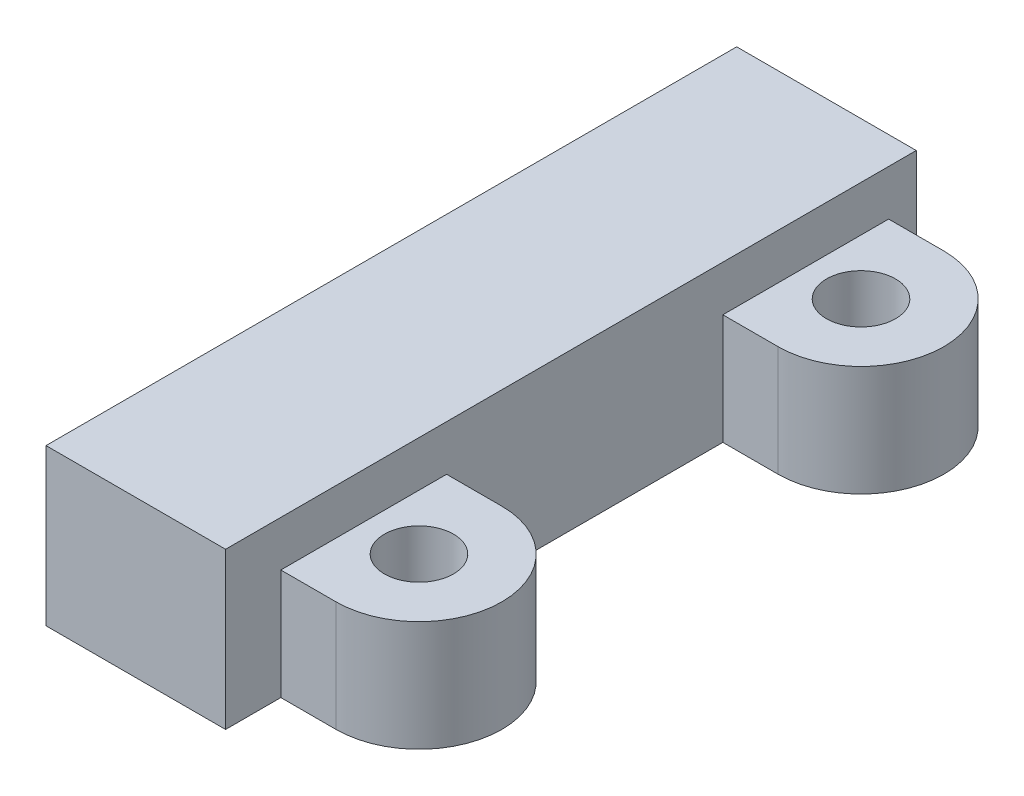
ISO-10303-21;
HEADER;
FILE_DESCRIPTION(('STEP AP214'),'2;1');
FILE_NAME('part.step','',(''),(''),'','','');
FILE_SCHEMA(('AUTOMOTIVE_DESIGN { 1 0 10303 214 1 1 1 1 }'));
ENDSEC;
DATA;
#1=APPLICATION_CONTEXT('core data for automotive mechanical design processes');
#2=APPLICATION_PROTOCOL_DEFINITION('international standard','automotive_design',2000,#1);
#3=PRODUCT_CONTEXT('',#1,'mechanical');
#4=PRODUCT('Part','Part','',(#3));
#5=PRODUCT_RELATED_PRODUCT_CATEGORY('part','',(#4));
#6=PRODUCT_DEFINITION_FORMATION('','',#4);
#7=PRODUCT_DEFINITION_CONTEXT('part definition',#1,'design');
#8=PRODUCT_DEFINITION('design','',#6,#7);
#9=PRODUCT_DEFINITION_SHAPE('','',#8);
#10=(LENGTH_UNIT() NAMED_UNIT(*) SI_UNIT(.MILLI.,.METRE.));
#11=(NAMED_UNIT(*) PLANE_ANGLE_UNIT() SI_UNIT($,.RADIAN.));
#12=(NAMED_UNIT(*) SI_UNIT($,.STERADIAN.) SOLID_ANGLE_UNIT());
#13=UNCERTAINTY_MEASURE_WITH_UNIT(LENGTH_MEASURE(1.E-05),#10,'distance_accuracy_value','');
#14=(GEOMETRIC_REPRESENTATION_CONTEXT(3) GLOBAL_UNCERTAINTY_ASSIGNED_CONTEXT((#13)) GLOBAL_UNIT_ASSIGNED_CONTEXT((#10,
#11,#12)) REPRESENTATION_CONTEXT('',''));
#15=CARTESIAN_POINT('',(0.,0.,0.));
#16=DIRECTION('',(0.,0.,1.));
#17=DIRECTION('',(1.,0.,0.));
#18=AXIS2_PLACEMENT_3D('',#15,#16,#17);
#19=CARTESIAN_POINT('',(13.,6.3,0.));
#20=DIRECTION('',(0.,-1.,0.));
#21=DIRECTION('',(1.,0.,0.));
#22=AXIS2_PLACEMENT_3D('',#19,#20,#21);
#23=PLANE('',#22);
#24=DIRECTION('',(-1.,0.,0.));
#25=VECTOR('',#24,1.);
#26=CARTESIAN_POINT('',(5.,6.3,40.5));
#27=LINE('',#26,#25);
#28=CARTESIAN_POINT('',(156.,6.3,40.5));
#29=VERTEX_POINT('',#28);
#30=CARTESIAN_POINT('',(148.,6.3,40.5));
#31=VERTEX_POINT('',#30);
#32=EDGE_CURVE('E172',#29,#31,#27,.T.);
#33=ORIENTED_EDGE('',*,*,#32,.T.);
#34=DIRECTION('',(0.,0.,1.));
#35=VECTOR('',#34,1.);
#36=CARTESIAN_POINT('',(148.,6.3,0.));
#37=LINE('',#36,#35);
#38=CARTESIAN_POINT('',(148.,6.3,0.));
#39=VERTEX_POINT('',#38);
#40=EDGE_CURVE('E58',#39,#31,#37,.T.);
#41=ORIENTED_EDGE('',*,*,#40,.F.);
#42=DIRECTION('',(-1.,0.,0.));
#43=VECTOR('',#42,1.);
#44=CARTESIAN_POINT('',(148.,6.3,0.));
#45=LINE('',#44,#43);
#46=CARTESIAN_POINT('',(156.,6.3,0.));
#47=VERTEX_POINT('',#46);
#48=EDGE_CURVE('E206',#39,#47,#45,.F.);
#49=ORIENTED_EDGE('',*,*,#48,.T.);
#50=DIRECTION('',(0.,0.,1.));
#51=VECTOR('',#50,1.);
#52=CARTESIAN_POINT('',(156.,6.3,0.));
#53=LINE('',#52,#51);
#54=EDGE_CURVE('E214',#47,#29,#53,.T.);
#55=ORIENTED_EDGE('',*,*,#54,.T.);
#56=EDGE_LOOP('',(#33,#41,#49,#55));
#57=FACE_BOUND('',#56,.T.);
#58=ADVANCED_FACE('F44',(#57),#23,.T.);
#59=CARTESIAN_POINT('',(0.,11.3,0.));
#60=DIRECTION('',(0.,1.,0.));
#61=DIRECTION('',(0.,0.,1.));
#62=AXIS2_PLACEMENT_3D('',#59,#60,#61);
#63=PLANE('',#62);
#64=DIRECTION('',(0.,0.,1.));
#65=VECTOR('',#64,1.);
#66=CARTESIAN_POINT('',(148.,11.3,0.));
#67=LINE('',#66,#65);
#68=CARTESIAN_POINT('',(148.,11.3,0.));
#69=VERTEX_POINT('',#68);
#70=CARTESIAN_POINT('',(148.,11.3,50.));
#71=VERTEX_POINT('',#70);
#72=EDGE_CURVE('E193',#69,#71,#67,.T.);
#73=ORIENTED_EDGE('',*,*,#72,.T.);
#74=DIRECTION('',(-1.,0.,0.));
#75=VECTOR('',#74,1.);
#76=CARTESIAN_POINT('',(161.,11.3,50.));
#77=LINE('',#76,#75);
#78=CARTESIAN_POINT('',(161.,11.3,50.));
#79=VERTEX_POINT('',#78);
#80=EDGE_CURVE('E53',#79,#71,#77,.T.);
#81=ORIENTED_EDGE('',*,*,#80,.F.);
#82=DIRECTION('',(0.,0.,-1.));
#83=VECTOR('',#82,1.);
#84=CARTESIAN_POINT('',(161.,11.3,37.));
#85=LINE('',#84,#83);
#86=CARTESIAN_POINT('',(161.,11.3,0.));
#87=VERTEX_POINT('',#86);
#88=EDGE_CURVE('E229',#79,#87,#85,.T.);
#89=ORIENTED_EDGE('',*,*,#88,.T.);
#90=DIRECTION('',(1.,0.,0.));
#91=VECTOR('',#90,1.);
#92=CARTESIAN_POINT('',(161.,11.3,0.));
#93=LINE('',#92,#91);
#94=EDGE_CURVE('E197',#87,#69,#93,.F.);
#95=ORIENTED_EDGE('',*,*,#94,.T.);
#96=EDGE_LOOP('',(#73,#81,#89,#95));
#97=FACE_BOUND('',#96,.T.);
#98=ADVANCED_FACE('F358',(#97),#63,.T.);
#99=CARTESIAN_POINT('',(5.,0.,0.));
#100=DIRECTION('',(0.,-1.,0.));
#101=DIRECTION('',(1.,0.,0.));
#102=AXIS2_PLACEMENT_3D('',#99,#100,#101);
#103=PLANE('',#102);
#104=CARTESIAN_POINT('',(165.,0.,40.));
#105=DIRECTION('',(0.,-1.,0.));
#106=DIRECTION('',(1.,0.,0.));
#107=AXIS2_PLACEMENT_3D('',#104,#105,#106);
#108=CIRCLE('',#107,2.5);
#109=CARTESIAN_POINT('',(167.5,0.,40.));
#110=VERTEX_POINT('',#109);
#111=EDGE_CURVE('E245',#110,#110,#108,.T.);
#112=ORIENTED_EDGE('',*,*,#111,.F.);
#113=EDGE_LOOP('',(#112));
#114=FACE_BOUND('',#113,.T.);
#115=CARTESIAN_POINT('',(165.,0.,7.99999999999902));
#116=DIRECTION('',(0.,1.,0.));
#117=DIRECTION('',(1.,0.,0.));
#118=AXIS2_PLACEMENT_3D('',#115,#116,#117);
#119=CIRCLE('',#118,2.5);
#120=CARTESIAN_POINT('',(167.5,0.,7.99999999999902));
#121=VERTEX_POINT('',#120);
#122=EDGE_CURVE('E250',#121,#121,#119,.T.);
#123=ORIENTED_EDGE('',*,*,#122,.T.);
#124=EDGE_LOOP('',(#123));
#125=FACE_BOUND('',#124,.T.);
#126=DIRECTION('',(-1.,0.,0.));
#127=VECTOR('',#126,1.);
#128=CARTESIAN_POINT('',(161.,0.,50.));
#129=LINE('',#128,#127);
#130=CARTESIAN_POINT('',(161.,0.,50.));
#131=VERTEX_POINT('',#130);
#132=CARTESIAN_POINT('',(148.,0.,50.));
#133=VERTEX_POINT('',#132);
#134=EDGE_CURVE('E164',#131,#133,#129,.T.);
#135=ORIENTED_EDGE('',*,*,#134,.T.);
#136=DIRECTION('',(0.,0.,-1.));
#137=VECTOR('',#136,1.);
#138=CARTESIAN_POINT('',(148.,0.,0.));
#139=LINE('',#138,#137);
#140=CARTESIAN_POINT('',(148.,0.,40.5));
#141=VERTEX_POINT('',#140);
#142=EDGE_CURVE('E151',#133,#141,#139,.T.);
#143=ORIENTED_EDGE('',*,*,#142,.T.);
#144=DIRECTION('',(-1.,0.,0.));
#145=VECTOR('',#144,1.);
#146=CARTESIAN_POINT('',(5.,0.,40.5));
#147=LINE('',#146,#145);
#148=CARTESIAN_POINT('',(156.,0.,40.5));
#149=VERTEX_POINT('',#148);
#150=EDGE_CURVE('E161',#149,#141,#147,.T.);
#151=ORIENTED_EDGE('',*,*,#150,.F.);
#152=DIRECTION('',(0.,0.,1.));
#153=VECTOR('',#152,1.);
#154=CARTESIAN_POINT('',(156.,0.,0.));
#155=LINE('',#154,#153);
#156=CARTESIAN_POINT('',(156.,0.,0.));
#157=VERTEX_POINT('',#156);
#158=EDGE_CURVE('E194',#157,#149,#155,.T.);
#159=ORIENTED_EDGE('',*,*,#158,.F.);
#160=DIRECTION('',(-1.,0.,0.));
#161=VECTOR('',#160,1.);
#162=CARTESIAN_POINT('',(156.,0.,0.));
#163=LINE('',#162,#161);
#164=CARTESIAN_POINT('',(161.,0.,0.));
#165=VERTEX_POINT('',#164);
#166=EDGE_CURVE('E187',#157,#165,#163,.F.);
#167=ORIENTED_EDGE('',*,*,#166,.T.);
#168=DIRECTION('',(0.,0.,1.));
#169=VECTOR('',#168,1.);
#170=CARTESIAN_POINT('',(161.,0.,37.));
#171=LINE('',#170,#169);
#172=CARTESIAN_POINT('',(161.,0.,1.99999999999902));
#173=VERTEX_POINT('',#172);
#174=EDGE_CURVE('E222',#165,#173,#171,.T.);
#175=ORIENTED_EDGE('',*,*,#174,.T.);
#176=DIRECTION('',(-1.,0.,0.));
#177=VECTOR('',#176,1.);
#178=CARTESIAN_POINT('',(161.,0.,1.99999999999903));
#179=LINE('',#178,#177);
#180=CARTESIAN_POINT('',(165.,0.,1.99999999999902));
#181=VERTEX_POINT('',#180);
#182=EDGE_CURVE('E246',#181,#173,#179,.T.);
#183=ORIENTED_EDGE('',*,*,#182,.F.);
#184=CARTESIAN_POINT('',(165.,0.,7.99999999999902));
#185=DIRECTION('',(0.,1.,0.));
#186=DIRECTION('',(1.,0.,0.));
#187=AXIS2_PLACEMENT_3D('',#184,#185,#186);
#188=CIRCLE('',#187,6.);
#189=CARTESIAN_POINT('',(165.,0.,13.999999999999));
#190=VERTEX_POINT('',#189);
#191=EDGE_CURVE('E254',#190,#181,#188,.T.);
#192=ORIENTED_EDGE('',*,*,#191,.F.);
#193=DIRECTION('',(1.,0.,0.));
#194=VECTOR('',#193,1.);
#195=CARTESIAN_POINT('',(161.,0.,13.999999999999));
#196=LINE('',#195,#194);
#197=CARTESIAN_POINT('',(161.,0.,13.999999999999));
#198=VERTEX_POINT('',#197);
#199=EDGE_CURVE('E264',#198,#190,#196,.T.);
#200=ORIENTED_EDGE('',*,*,#199,.F.);
#201=CARTESIAN_POINT('',(161.,0.,34.));
#202=VERTEX_POINT('',#201);
#203=EDGE_CURVE('E228',#198,#202,#171,.T.);
#204=ORIENTED_EDGE('',*,*,#203,.T.);
#205=DIRECTION('',(1.,0.,0.));
#206=VECTOR('',#205,1.);
#207=CARTESIAN_POINT('',(161.,0.,34.));
#208=LINE('',#207,#206);
#209=CARTESIAN_POINT('',(165.,0.,34.));
#210=VERTEX_POINT('',#209);
#211=EDGE_CURVE('E241',#202,#210,#208,.T.);
#212=ORIENTED_EDGE('',*,*,#211,.T.);
#213=CARTESIAN_POINT('',(165.,0.,40.));
#214=DIRECTION('',(0.,-1.,0.));
#215=DIRECTION('',(1.,0.,0.));
#216=AXIS2_PLACEMENT_3D('',#213,#214,#215);
#217=CIRCLE('',#216,6.);
#218=CARTESIAN_POINT('',(165.,0.,46.));
#219=VERTEX_POINT('',#218);
#220=EDGE_CURVE('E320',#210,#219,#217,.T.);
#221=ORIENTED_EDGE('',*,*,#220,.T.);
#222=DIRECTION('',(-1.,0.,0.));
#223=VECTOR('',#222,1.);
#224=CARTESIAN_POINT('',(161.,0.,46.));
#225=LINE('',#224,#223);
#226=CARTESIAN_POINT('',(161.,0.,46.));
#227=VERTEX_POINT('',#226);
#228=EDGE_CURVE('E301',#219,#227,#225,.T.);
#229=ORIENTED_EDGE('',*,*,#228,.T.);
#230=EDGE_CURVE('E220',#227,#131,#171,.T.);
#231=ORIENTED_EDGE('',*,*,#230,.T.);
#232=EDGE_LOOP('',(#135,#143,#151,#159,#167,#175,#183,#192,#200,#204,#212,#221,#229,#231));
#233=FACE_BOUND('',#232,.T.);
#234=ADVANCED_FACE('F50',(#114,#125,#233),#103,.T.);
#235=CARTESIAN_POINT('',(161.,11.3,50.));
#236=DIRECTION('',(0.,0.,1.));
#237=DIRECTION('',(1.,0.,0.));
#238=AXIS2_PLACEMENT_3D('',#235,#236,#237);
#239=PLANE('',#238);
#240=ORIENTED_EDGE('',*,*,#80,.T.);
#241=DIRECTION('',(0.,-1.,0.));
#242=VECTOR('',#241,1.);
#243=CARTESIAN_POINT('',(148.,11.3,50.));
#244=LINE('',#243,#242);
#245=EDGE_CURVE('E170',#71,#133,#244,.T.);
#246=ORIENTED_EDGE('',*,*,#245,.T.);
#247=ORIENTED_EDGE('',*,*,#134,.F.);
#248=DIRECTION('',(0.,1.,0.));
#249=VECTOR('',#248,1.);
#250=CARTESIAN_POINT('',(161.,11.3,50.));
#251=LINE('',#250,#249);
#252=EDGE_CURVE('E223',#131,#79,#251,.T.);
#253=ORIENTED_EDGE('',*,*,#252,.T.);
#254=EDGE_LOOP('',(#240,#246,#247,#253));
#255=FACE_BOUND('',#254,.T.);
#256=ADVANCED_FACE('F352',(#255),#239,.T.);
#257=CARTESIAN_POINT('',(5.,6.3,40.5));
#258=DIRECTION('',(0.,0.,1.));
#259=DIRECTION('',(0.,-1.,0.));
#260=AXIS2_PLACEMENT_3D('',#257,#258,#259);
#261=PLANE('',#260);
#262=DIRECTION('',(0.,-1.,0.));
#263=VECTOR('',#262,1.);
#264=CARTESIAN_POINT('',(148.,6.3,40.5));
#265=LINE('',#264,#263);
#266=EDGE_CURVE('E11',#31,#141,#265,.T.);
#267=ORIENTED_EDGE('',*,*,#266,.F.);
#268=ORIENTED_EDGE('',*,*,#32,.F.);
#269=DIRECTION('',(0.,-1.,0.));
#270=VECTOR('',#269,1.);
#271=CARTESIAN_POINT('',(156.,6.3,40.5));
#272=LINE('',#271,#270);
#273=EDGE_CURVE('E175',#29,#149,#272,.T.);
#274=ORIENTED_EDGE('',*,*,#273,.T.);
#275=ORIENTED_EDGE('',*,*,#150,.T.);
#276=EDGE_LOOP('',(#267,#268,#274,#275));
#277=FACE_BOUND('',#276,.T.);
#278=ADVANCED_FACE('F167',(#277),#261,.F.);
#279=CARTESIAN_POINT('',(161.,0.,0.));
#280=DIRECTION('',(-1.,0.,0.));
#281=DIRECTION('',(0.,0.,1.));
#282=AXIS2_PLACEMENT_3D('',#279,#280,#281);
#283=PLANE('',#282);
#284=DIRECTION('',(0.,-1.,0.));
#285=VECTOR('',#284,1.);
#286=CARTESIAN_POINT('',(161.,8.,13.999999999999));
#287=LINE('',#286,#285);
#288=CARTESIAN_POINT('',(161.,8.,13.999999999999));
#289=VERTEX_POINT('',#288);
#290=EDGE_CURVE('E278',#289,#198,#287,.T.);
#291=ORIENTED_EDGE('',*,*,#290,.F.);
#292=DIRECTION('',(0.,0.,1.));
#293=VECTOR('',#292,1.);
#294=CARTESIAN_POINT('',(161.,8.,1.99999999999903));
#295=LINE('',#294,#293);
#296=CARTESIAN_POINT('',(161.,8.,1.99999999999902));
#297=VERTEX_POINT('',#296);
#298=EDGE_CURVE('E66',#297,#289,#295,.T.);
#299=ORIENTED_EDGE('',*,*,#298,.F.);
#300=DIRECTION('',(0.,-1.,0.));
#301=VECTOR('',#300,1.);
#302=CARTESIAN_POINT('',(161.,8.,1.99999999999903));
#303=LINE('',#302,#301);
#304=EDGE_CURVE('E271',#297,#173,#303,.T.);
#305=ORIENTED_EDGE('',*,*,#304,.T.);
#306=ORIENTED_EDGE('',*,*,#174,.F.);
#307=DIRECTION('',(0.,-1.,0.));
#308=VECTOR('',#307,1.);
#309=CARTESIAN_POINT('',(161.,0.,0.));
#310=LINE('',#309,#308);
#311=EDGE_CURVE('E188',#165,#87,#310,.F.);
#312=ORIENTED_EDGE('',*,*,#311,.T.);
#313=ORIENTED_EDGE('',*,*,#88,.F.);
#314=ORIENTED_EDGE('',*,*,#252,.F.);
#315=ORIENTED_EDGE('',*,*,#230,.F.);
#316=DIRECTION('',(0.,-1.,0.));
#317=VECTOR('',#316,1.);
#318=CARTESIAN_POINT('',(161.,8.,46.));
#319=LINE('',#318,#317);
#320=CARTESIAN_POINT('',(161.,8.,46.));
#321=VERTEX_POINT('',#320);
#322=EDGE_CURVE('E174',#321,#227,#319,.T.);
#323=ORIENTED_EDGE('',*,*,#322,.F.);
#324=DIRECTION('',(0.,0.,-1.));
#325=VECTOR('',#324,1.);
#326=CARTESIAN_POINT('',(161.,8.,46.));
#327=LINE('',#326,#325);
#328=CARTESIAN_POINT('',(161.,8.,34.));
#329=VERTEX_POINT('',#328);
#330=EDGE_CURVE('E298',#321,#329,#327,.T.);
#331=ORIENTED_EDGE('',*,*,#330,.T.);
#332=DIRECTION('',(0.,-1.,0.));
#333=VECTOR('',#332,1.);
#334=CARTESIAN_POINT('',(161.,8.,34.));
#335=LINE('',#334,#333);
#336=EDGE_CURVE('E312',#329,#202,#335,.T.);
#337=ORIENTED_EDGE('',*,*,#336,.T.);
#338=ORIENTED_EDGE('',*,*,#203,.F.);
#339=EDGE_LOOP('',(#291,#299,#305,#306,#312,#313,#314,#315,#323,#331,#337,#338));
#340=FACE_BOUND('',#339,.T.);
#341=ADVANCED_FACE('F329',(#340),#283,.F.);
#342=CARTESIAN_POINT('',(161.,0.,0.));
#343=DIRECTION('',(0.,0.,-1.));
#344=DIRECTION('',(1.,0.,0.));
#345=AXIS2_PLACEMENT_3D('',#342,#343,#344);
#346=PLANE('',#345);
#347=ORIENTED_EDGE('',*,*,#166,.F.);
#348=DIRECTION('',(0.,1.,0.));
#349=VECTOR('',#348,1.);
#350=CARTESIAN_POINT('',(156.,6.3,0.));
#351=LINE('',#350,#349);
#352=EDGE_CURVE('E192',#47,#157,#351,.F.);
#353=ORIENTED_EDGE('',*,*,#352,.F.);
#354=ORIENTED_EDGE('',*,*,#48,.F.);
#355=DIRECTION('',(0.,1.,0.));
#356=VECTOR('',#355,1.);
#357=CARTESIAN_POINT('',(148.,11.3,0.));
#358=LINE('',#357,#356);
#359=EDGE_CURVE('E204',#69,#39,#358,.F.);
#360=ORIENTED_EDGE('',*,*,#359,.F.);
#361=ORIENTED_EDGE('',*,*,#94,.F.);
#362=ORIENTED_EDGE('',*,*,#311,.F.);
#363=EDGE_LOOP('',(#347,#353,#354,#360,#361,#362));
#364=FACE_BOUND('',#363,.T.);
#365=ADVANCED_FACE('F360',(#364),#346,.T.);
#366=CARTESIAN_POINT('',(148.,11.3,0.));
#367=DIRECTION('',(-1.,0.,0.));
#368=DIRECTION('',(0.,0.,1.));
#369=AXIS2_PLACEMENT_3D('',#366,#367,#368);
#370=PLANE('',#369);
#371=ORIENTED_EDGE('',*,*,#40,.T.);
#372=ORIENTED_EDGE('',*,*,#266,.T.);
#373=ORIENTED_EDGE('',*,*,#142,.F.);
#374=ORIENTED_EDGE('',*,*,#245,.F.);
#375=ORIENTED_EDGE('',*,*,#72,.F.);
#376=ORIENTED_EDGE('',*,*,#359,.T.);
#377=EDGE_LOOP('',(#371,#372,#373,#374,#375,#376));
#378=FACE_BOUND('',#377,.T.);
#379=ADVANCED_FACE('F153',(#378),#370,.T.);
#380=CARTESIAN_POINT('',(156.,6.3,0.));
#381=DIRECTION('',(-1.,0.,0.));
#382=DIRECTION('',(0.,-1.,0.));
#383=AXIS2_PLACEMENT_3D('',#380,#381,#382);
#384=PLANE('',#383);
#385=ORIENTED_EDGE('',*,*,#158,.T.);
#386=ORIENTED_EDGE('',*,*,#273,.F.);
#387=ORIENTED_EDGE('',*,*,#54,.F.);
#388=ORIENTED_EDGE('',*,*,#352,.T.);
#389=EDGE_LOOP('',(#385,#386,#387,#388));
#390=FACE_BOUND('',#389,.T.);
#391=ADVANCED_FACE('F361',(#390),#384,.T.);
#392=CARTESIAN_POINT('',(161.,8.,46.));
#393=DIRECTION('',(0.,0.,1.));
#394=DIRECTION('',(0.,-1.,0.));
#395=AXIS2_PLACEMENT_3D('',#392,#393,#394);
#396=PLANE('',#395);
#397=ORIENTED_EDGE('',*,*,#228,.F.);
#398=DIRECTION('',(0.,-1.,0.));
#399=VECTOR('',#398,1.);
#400=CARTESIAN_POINT('',(165.,8.,46.));
#401=LINE('',#400,#399);
#402=CARTESIAN_POINT('',(165.,8.,46.));
#403=VERTEX_POINT('',#402);
#404=EDGE_CURVE('E179',#403,#219,#401,.T.);
#405=ORIENTED_EDGE('',*,*,#404,.F.);
#406=DIRECTION('',(-1.,0.,0.));
#407=VECTOR('',#406,1.);
#408=CARTESIAN_POINT('',(161.,8.,46.));
#409=LINE('',#408,#407);
#410=EDGE_CURVE('E307',#403,#321,#409,.T.);
#411=ORIENTED_EDGE('',*,*,#410,.T.);
#412=ORIENTED_EDGE('',*,*,#322,.T.);
#413=EDGE_LOOP('',(#397,#405,#411,#412));
#414=FACE_BOUND('',#413,.T.);
#415=ADVANCED_FACE('F401',(#414),#396,.T.);
#416=CARTESIAN_POINT('',(165.,8.,40.));
#417=DIRECTION('',(0.,-1.,0.));
#418=DIRECTION('',(1.,0.,0.));
#419=AXIS2_PLACEMENT_3D('',#416,#417,#418);
#420=CYLINDRICAL_SURFACE('',#419,6.);
#421=ORIENTED_EDGE('',*,*,#220,.F.);
#422=DIRECTION('',(0.,-1.,0.));
#423=VECTOR('',#422,1.);
#424=CARTESIAN_POINT('',(165.,8.,34.));
#425=LINE('',#424,#423);
#426=CARTESIAN_POINT('',(165.,8.,34.));
#427=VERTEX_POINT('',#426);
#428=EDGE_CURVE('E328',#427,#210,#425,.T.);
#429=ORIENTED_EDGE('',*,*,#428,.F.);
#430=CARTESIAN_POINT('',(165.,8.,40.));
#431=DIRECTION('',(0.,-1.,0.));
#432=DIRECTION('',(1.,0.,0.));
#433=AXIS2_PLACEMENT_3D('',#430,#431,#432);
#434=CIRCLE('',#433,6.);
#435=EDGE_CURVE('E304',#427,#403,#434,.T.);
#436=ORIENTED_EDGE('',*,*,#435,.T.);
#437=ORIENTED_EDGE('',*,*,#404,.T.);
#438=EDGE_LOOP('',(#421,#429,#436,#437));
#439=FACE_BOUND('',#438,.T.);
#440=ADVANCED_FACE('F345',(#439),#420,.T.);
#441=CARTESIAN_POINT('',(161.,8.,34.));
#442=DIRECTION('',(0.,0.,-1.));
#443=DIRECTION('',(-1.,0.,0.));
#444=AXIS2_PLACEMENT_3D('',#441,#442,#443);
#445=PLANE('',#444);
#446=ORIENTED_EDGE('',*,*,#211,.F.);
#447=ORIENTED_EDGE('',*,*,#336,.F.);
#448=DIRECTION('',(1.,0.,0.));
#449=VECTOR('',#448,1.);
#450=CARTESIAN_POINT('',(161.,8.,34.));
#451=LINE('',#450,#449);
#452=EDGE_CURVE('E297',#329,#427,#451,.T.);
#453=ORIENTED_EDGE('',*,*,#452,.T.);
#454=ORIENTED_EDGE('',*,*,#428,.T.);
#455=EDGE_LOOP('',(#446,#447,#453,#454));
#456=FACE_BOUND('',#455,.T.);
#457=ADVANCED_FACE('F337',(#456),#445,.T.);
#458=CARTESIAN_POINT('',(165.,8.,40.));
#459=DIRECTION('',(0.,-1.,0.));
#460=DIRECTION('',(1.,0.,0.));
#461=AXIS2_PLACEMENT_3D('',#458,#459,#460);
#462=PLANE('',#461);
#463=CARTESIAN_POINT('',(165.,8.,40.));
#464=DIRECTION('',(0.,-1.,0.));
#465=DIRECTION('',(1.,0.,0.));
#466=AXIS2_PLACEMENT_3D('',#463,#464,#465);
#467=CIRCLE('',#466,2.5);
#468=CARTESIAN_POINT('',(167.5,8.,40.));
#469=VERTEX_POINT('',#468);
#470=EDGE_CURVE('E238',#469,#469,#467,.T.);
#471=ORIENTED_EDGE('',*,*,#470,.T.);
#472=EDGE_LOOP('',(#471));
#473=FACE_BOUND('',#472,.T.);
#474=ORIENTED_EDGE('',*,*,#330,.F.);
#475=ORIENTED_EDGE('',*,*,#410,.F.);
#476=ORIENTED_EDGE('',*,*,#435,.F.);
#477=ORIENTED_EDGE('',*,*,#452,.F.);
#478=EDGE_LOOP('',(#474,#475,#476,#477));
#479=FACE_BOUND('',#478,.T.);
#480=ADVANCED_FACE('F339',(#473,#479),#462,.F.);
#481=CARTESIAN_POINT('',(165.,11.3,40.));
#482=DIRECTION('',(0.,-1.,0.));
#483=DIRECTION('',(1.,0.,0.));
#484=AXIS2_PLACEMENT_3D('',#481,#482,#483);
#485=CYLINDRICAL_SURFACE('',#484,2.5);
#486=ORIENTED_EDGE('',*,*,#111,.T.);
#487=EDGE_LOOP('',(#486));
#488=FACE_BOUND('',#487,.T.);
#489=ORIENTED_EDGE('',*,*,#470,.F.);
#490=EDGE_LOOP('',(#489));
#491=FACE_BOUND('',#490,.T.);
#492=ADVANCED_FACE('F416',(#488,#491),#485,.F.);
#493=CARTESIAN_POINT('',(161.,8.,13.999999999999));
#494=DIRECTION('',(0.,0.,-1.));
#495=DIRECTION('',(-1.,0.,0.));
#496=AXIS2_PLACEMENT_3D('',#493,#494,#495);
#497=PLANE('',#496);
#498=ORIENTED_EDGE('',*,*,#199,.T.);
#499=DIRECTION('',(0.,-1.,0.));
#500=VECTOR('',#499,1.);
#501=CARTESIAN_POINT('',(165.,8.,13.999999999999));
#502=LINE('',#501,#500);
#503=CARTESIAN_POINT('',(165.,8.,13.999999999999));
#504=VERTEX_POINT('',#503);
#505=EDGE_CURVE('E281',#504,#190,#502,.T.);
#506=ORIENTED_EDGE('',*,*,#505,.F.);
#507=DIRECTION('',(1.,0.,0.));
#508=VECTOR('',#507,1.);
#509=CARTESIAN_POINT('',(161.,8.,13.999999999999));
#510=LINE('',#509,#508);
#511=EDGE_CURVE('E272',#289,#504,#510,.T.);
#512=ORIENTED_EDGE('',*,*,#511,.F.);
#513=ORIENTED_EDGE('',*,*,#290,.T.);
#514=EDGE_LOOP('',(#498,#506,#512,#513));
#515=FACE_BOUND('',#514,.T.);
#516=ADVANCED_FACE('F376',(#515),#497,.F.);
#517=CARTESIAN_POINT('',(165.,8.,7.99999999999902));
#518=DIRECTION('',(0.,-1.,0.));
#519=DIRECTION('',(1.,0.,0.));
#520=AXIS2_PLACEMENT_3D('',#517,#518,#519);
#521=CYLINDRICAL_SURFACE('',#520,6.);
#522=ORIENTED_EDGE('',*,*,#191,.T.);
#523=DIRECTION('',(0.,-1.,0.));
#524=VECTOR('',#523,1.);
#525=CARTESIAN_POINT('',(165.,8.,1.99999999999902));
#526=LINE('',#525,#524);
#527=CARTESIAN_POINT('',(165.,8.,1.99999999999902));
#528=VERTEX_POINT('',#527);
#529=EDGE_CURVE('E290',#528,#181,#526,.T.);
#530=ORIENTED_EDGE('',*,*,#529,.F.);
#531=CARTESIAN_POINT('',(165.,8.,7.99999999999902));
#532=DIRECTION('',(0.,1.,0.));
#533=DIRECTION('',(1.,0.,0.));
#534=AXIS2_PLACEMENT_3D('',#531,#532,#533);
#535=CIRCLE('',#534,6.);
#536=EDGE_CURVE('E269',#504,#528,#535,.T.);
#537=ORIENTED_EDGE('',*,*,#536,.F.);
#538=ORIENTED_EDGE('',*,*,#505,.T.);
#539=EDGE_LOOP('',(#522,#530,#537,#538));
#540=FACE_BOUND('',#539,.T.);
#541=ADVANCED_FACE('F375',(#540),#521,.T.);
#542=CARTESIAN_POINT('',(161.,8.,1.99999999999903));
#543=DIRECTION('',(0.,0.,1.));
#544=DIRECTION('',(1.,0.,0.));
#545=AXIS2_PLACEMENT_3D('',#542,#543,#544);
#546=PLANE('',#545);
#547=ORIENTED_EDGE('',*,*,#182,.T.);
#548=ORIENTED_EDGE('',*,*,#304,.F.);
#549=DIRECTION('',(-1.,0.,0.));
#550=VECTOR('',#549,1.);
#551=CARTESIAN_POINT('',(161.,8.,1.99999999999903));
#552=LINE('',#551,#550);
#553=EDGE_CURVE('E262',#528,#297,#552,.T.);
#554=ORIENTED_EDGE('',*,*,#553,.F.);
#555=ORIENTED_EDGE('',*,*,#529,.T.);
#556=EDGE_LOOP('',(#547,#548,#554,#555));
#557=FACE_BOUND('',#556,.T.);
#558=ADVANCED_FACE('F370',(#557),#546,.F.);
#559=CARTESIAN_POINT('',(165.,8.,7.99999999999902));
#560=DIRECTION('',(0.,-1.,0.));
#561=DIRECTION('',(1.,0.,0.));
#562=AXIS2_PLACEMENT_3D('',#559,#560,#561);
#563=PLANE('',#562);
#564=CARTESIAN_POINT('',(165.,8.,7.99999999999902));
#565=DIRECTION('',(0.,-1.,0.));
#566=DIRECTION('',(1.,0.,0.));
#567=AXIS2_PLACEMENT_3D('',#564,#565,#566);
#568=CIRCLE('',#567,2.5);
#569=CARTESIAN_POINT('',(167.5,8.,7.99999999999902));
#570=VERTEX_POINT('',#569);
#571=EDGE_CURVE('E243',#570,#570,#568,.F.);
#572=ORIENTED_EDGE('',*,*,#571,.F.);
#573=EDGE_LOOP('',(#572));
#574=FACE_BOUND('',#573,.T.);
#575=ORIENTED_EDGE('',*,*,#298,.T.);
#576=ORIENTED_EDGE('',*,*,#511,.T.);
#577=ORIENTED_EDGE('',*,*,#536,.T.);
#578=ORIENTED_EDGE('',*,*,#553,.T.);
#579=EDGE_LOOP('',(#575,#576,#577,#578));
#580=FACE_BOUND('',#579,.T.);
#581=ADVANCED_FACE('F377',(#574,#580),#563,.F.);
#582=CARTESIAN_POINT('',(165.,11.3,7.99999999999902));
#583=DIRECTION('',(0.,-1.,0.));
#584=DIRECTION('',(1.,0.,0.));
#585=AXIS2_PLACEMENT_3D('',#582,#583,#584);
#586=CYLINDRICAL_SURFACE('',#585,2.5);
#587=ORIENTED_EDGE('',*,*,#122,.F.);
#588=EDGE_LOOP('',(#587));
#589=FACE_BOUND('',#588,.T.);
#590=ORIENTED_EDGE('',*,*,#571,.T.);
#591=EDGE_LOOP('',(#590));
#592=FACE_BOUND('',#591,.T.);
#593=ADVANCED_FACE('F379',(#589,#592),#586,.F.);
#594=CLOSED_SHELL('',(#58,#98,#234,#256,#278,#341,#365,#379,#391,#415,#440,#457,#480,#492,#516,
#541,#558,#581,#593));
#595=MANIFOLD_SOLID_BREP('B2',#594);
#596=ADVANCED_BREP_SHAPE_REPRESENTATION('',(#18,#595),#14);
#597=SHAPE_DEFINITION_REPRESENTATION(#9,#596);
ENDSEC;
END-ISO-10303-21;
